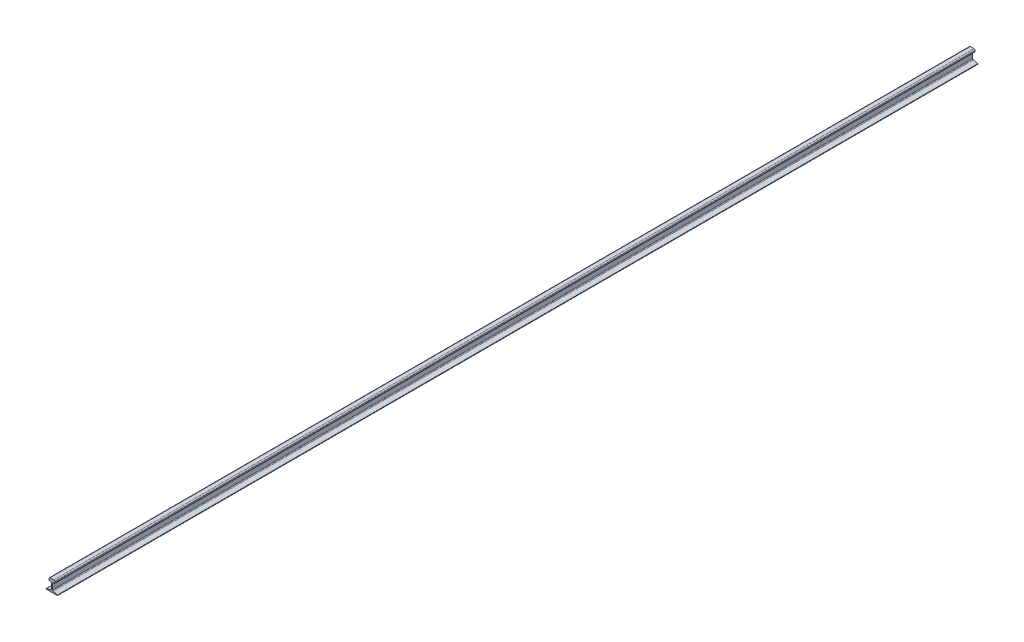
ISO-10303-21;
HEADER;
FILE_DESCRIPTION(('STEP AP214'),'2;1');
FILE_NAME('part.step','',(''),(''),'','','');
FILE_SCHEMA(('AUTOMOTIVE_DESIGN { 1 0 10303 214 1 1 1 1 }'));
ENDSEC;
DATA;
#1=APPLICATION_CONTEXT('core data for automotive mechanical design processes');
#2=APPLICATION_PROTOCOL_DEFINITION('international standard','automotive_design',2000,#1);
#3=PRODUCT_CONTEXT('',#1,'mechanical');
#4=PRODUCT('Part','Part','',(#3));
#5=PRODUCT_RELATED_PRODUCT_CATEGORY('part','',(#4));
#6=PRODUCT_DEFINITION_FORMATION('','',#4);
#7=PRODUCT_DEFINITION_CONTEXT('part definition',#1,'design');
#8=PRODUCT_DEFINITION('design','',#6,#7);
#9=PRODUCT_DEFINITION_SHAPE('','',#8);
#10=(LENGTH_UNIT() NAMED_UNIT(*) SI_UNIT(.MILLI.,.METRE.));
#11=(NAMED_UNIT(*) PLANE_ANGLE_UNIT() SI_UNIT($,.RADIAN.));
#12=(NAMED_UNIT(*) SI_UNIT($,.STERADIAN.) SOLID_ANGLE_UNIT());
#13=UNCERTAINTY_MEASURE_WITH_UNIT(LENGTH_MEASURE(1.E-05),#10,'distance_accuracy_value','');
#14=(GEOMETRIC_REPRESENTATION_CONTEXT(3) GLOBAL_UNCERTAINTY_ASSIGNED_CONTEXT((#13)) GLOBAL_UNIT_ASSIGNED_CONTEXT((#10,
#11,#12)) REPRESENTATION_CONTEXT('',''));
#15=CARTESIAN_POINT('',(0.,0.,0.));
#16=DIRECTION('',(0.,0.,1.));
#17=DIRECTION('',(1.,0.,0.));
#18=AXIS2_PLACEMENT_3D('',#15,#16,#17);
#19=CARTESIAN_POINT('',(-9.7,25.4,2500.));
#20=DIRECTION('',(0.,0.,-1.));
#21=DIRECTION('',(-1.,0.,0.));
#22=AXIS2_PLACEMENT_3D('',#19,#20,#21);
#23=CYLINDRICAL_SURFACE('',#22,6.35);
#24=CARTESIAN_POINT('',(-9.7,25.4,-2500.));
#25=DIRECTION('',(0.,0.,1.));
#26=DIRECTION('',(-1.,0.,0.));
#27=AXIS2_PLACEMENT_3D('',#24,#25,#26);
#28=CIRCLE('',#27,6.35);
#29=CARTESIAN_POINT('',(-9.7,31.75,-2500.));
#30=VERTEX_POINT('',#29);
#31=CARTESIAN_POINT('',(-16.05,25.4,-2500.));
#32=VERTEX_POINT('',#31);
#33=EDGE_CURVE('E238',#30,#32,#28,.T.);
#34=ORIENTED_EDGE('',*,*,#33,.T.);
#35=DIRECTION('',(0.,0.,-1.));
#36=VECTOR('',#35,1.);
#37=CARTESIAN_POINT('',(-16.05,25.4,2500.));
#38=LINE('',#37,#36);
#39=CARTESIAN_POINT('',(-16.05,25.4,2500.));
#40=VERTEX_POINT('',#39);
#41=EDGE_CURVE('E11',#40,#32,#38,.T.);
#42=ORIENTED_EDGE('',*,*,#41,.F.);
#43=CARTESIAN_POINT('',(-9.7,25.4,2500.));
#44=DIRECTION('',(0.,0.,1.));
#45=DIRECTION('',(-1.,0.,0.));
#46=AXIS2_PLACEMENT_3D('',#43,#44,#45);
#47=CIRCLE('',#46,6.35);
#48=CARTESIAN_POINT('',(-9.7,31.75,2500.));
#49=VERTEX_POINT('',#48);
#50=EDGE_CURVE('E308',#49,#40,#47,.T.);
#51=ORIENTED_EDGE('',*,*,#50,.F.);
#52=DIRECTION('',(0.,0.,-1.));
#53=VECTOR('',#52,1.);
#54=CARTESIAN_POINT('',(-9.7,31.75,2500.));
#55=LINE('',#54,#53);
#56=EDGE_CURVE('E234',#49,#30,#55,.T.);
#57=ORIENTED_EDGE('',*,*,#56,.T.);
#58=EDGE_LOOP('',(#34,#42,#51,#57));
#59=FACE_BOUND('',#58,.T.);
#60=ADVANCED_FACE('F41',(#59),#23,.T.);
#61=CARTESIAN_POINT('',(-16.05,19.8533423796229,2500.));
#62=DIRECTION('',(1.,0.,0.));
#63=DIRECTION('',(0.,0.,-1.));
#64=AXIS2_PLACEMENT_3D('',#61,#62,#63);
#65=PLANE('',#64);
#66=DIRECTION('',(0.,-1.,0.));
#67=VECTOR('',#66,1.);
#68=CARTESIAN_POINT('',(-16.05,19.8533423796229,-2500.));
#69=LINE('',#68,#67);
#70=CARTESIAN_POINT('',(-16.05,19.8533423796229,-2500.));
#71=VERTEX_POINT('',#70);
#72=EDGE_CURVE('E242',#32,#71,#69,.T.);
#73=ORIENTED_EDGE('',*,*,#72,.T.);
#74=DIRECTION('',(0.,0.,-1.));
#75=VECTOR('',#74,1.);
#76=CARTESIAN_POINT('',(-16.05,19.8533423796229,2500.));
#77=LINE('',#76,#75);
#78=CARTESIAN_POINT('',(-16.05,19.8533423796229,2500.));
#79=VERTEX_POINT('',#78);
#80=EDGE_CURVE('E50',#79,#71,#77,.T.);
#81=ORIENTED_EDGE('',*,*,#80,.F.);
#82=DIRECTION('',(0.,-1.,0.));
#83=VECTOR('',#82,1.);
#84=CARTESIAN_POINT('',(-16.05,19.8533423796229,2500.));
#85=LINE('',#84,#83);
#86=EDGE_CURVE('E149',#40,#79,#85,.T.);
#87=ORIENTED_EDGE('',*,*,#86,.F.);
#88=ORIENTED_EDGE('',*,*,#41,.T.);
#89=EDGE_LOOP('',(#73,#81,#87,#88));
#90=FACE_BOUND('',#89,.T.);
#91=ADVANCED_FACE('F486',(#90),#65,.F.);
#92=CARTESIAN_POINT('',(-14.46,19.8533423796229,2500.));
#93=DIRECTION('',(0.,0.,-1.));
#94=DIRECTION('',(-1.,0.,0.));
#95=AXIS2_PLACEMENT_3D('',#92,#93,#94);
#96=CYLINDRICAL_SURFACE('',#95,1.59);
#97=CARTESIAN_POINT('',(-14.46,19.8533423796229,-2500.));
#98=DIRECTION('',(0.,0.,1.));
#99=DIRECTION('',(-1.,0.,0.));
#100=AXIS2_PLACEMENT_3D('',#97,#98,#99);
#101=CIRCLE('',#100,1.59);
#102=CARTESIAN_POINT('',(-14.8176721764067,18.3040939766143,-2500.));
#103=VERTEX_POINT('',#102);
#104=EDGE_CURVE('E245',#71,#103,#101,.T.);
#105=ORIENTED_EDGE('',*,*,#104,.T.);
#106=DIRECTION('',(0.,0.,-1.));
#107=VECTOR('',#106,1.);
#108=CARTESIAN_POINT('',(-14.8176721764067,18.3040939766143,2500.));
#109=LINE('',#108,#107);
#110=CARTESIAN_POINT('',(-14.8176721764067,18.3040939766143,2500.));
#111=VERTEX_POINT('',#110);
#112=EDGE_CURVE('E383',#111,#103,#109,.T.);
#113=ORIENTED_EDGE('',*,*,#112,.F.);
#114=CARTESIAN_POINT('',(-14.46,19.8533423796229,2500.));
#115=DIRECTION('',(0.,0.,1.));
#116=DIRECTION('',(-1.,0.,0.));
#117=AXIS2_PLACEMENT_3D('',#114,#115,#116);
#118=CIRCLE('',#117,1.59);
#119=EDGE_CURVE('E393',#79,#111,#118,.T.);
#120=ORIENTED_EDGE('',*,*,#119,.F.);
#121=ORIENTED_EDGE('',*,*,#80,.T.);
#122=EDGE_LOOP('',(#105,#113,#120,#121));
#123=FACE_BOUND('',#122,.T.);
#124=ADVANCED_FACE('F391',(#123),#96,.T.);
#125=CARTESIAN_POINT('',(-6.6392329813232,16.415952513415,2500.));
#126=DIRECTION('',(0.224951054343864,0.974370064785236,0.));
#127=DIRECTION('',(-0.974370064785236,0.224951054343864,0.));
#128=AXIS2_PLACEMENT_3D('',#125,#126,#127);
#129=PLANE('',#128);
#130=DIRECTION('',(0.974370064785236,-0.224951054343864,0.));
#131=VECTOR('',#130,1.);
#132=CARTESIAN_POINT('',(-6.6392329813232,16.415952513415,-2500.));
#133=LINE('',#132,#131);
#134=CARTESIAN_POINT('',(-6.6392329813232,16.415952513415,-2500.));
#135=VERTEX_POINT('',#134);
#136=EDGE_CURVE('E248',#103,#135,#133,.T.);
#137=ORIENTED_EDGE('',*,*,#136,.T.);
#138=DIRECTION('',(0.,0.,-1.));
#139=VECTOR('',#138,1.);
#140=CARTESIAN_POINT('',(-6.6392329813232,16.415952513415,2500.));
#141=LINE('',#140,#139);
#142=CARTESIAN_POINT('',(-6.6392329813232,16.415952513415,2500.));
#143=VERTEX_POINT('',#142);
#144=EDGE_CURVE('E379',#143,#135,#141,.T.);
#145=ORIENTED_EDGE('',*,*,#144,.F.);
#146=DIRECTION('',(0.974370064785236,-0.224951054343864,0.));
#147=VECTOR('',#146,1.);
#148=CARTESIAN_POINT('',(-6.6392329813232,16.415952513415,2500.));
#149=LINE('',#148,#147);
#150=EDGE_CURVE('E412',#111,#143,#149,.T.);
#151=ORIENTED_EDGE('',*,*,#150,.F.);
#152=ORIENTED_EDGE('',*,*,#112,.T.);
#153=EDGE_LOOP('',(#137,#145,#151,#152));
#154=FACE_BOUND('',#153,.T.);
#155=ADVANCED_FACE('F402',(#154),#129,.F.);
#156=CARTESIAN_POINT('',(-7.70999999999999,11.7779510050373,2500.));
#157=DIRECTION('',(0.,0.,-1.));
#158=DIRECTION('',(-1.,0.,0.));
#159=AXIS2_PLACEMENT_3D('',#156,#157,#158);
#160=CYLINDRICAL_SURFACE('',#159,4.76);
#161=CARTESIAN_POINT('',(-7.70999999999999,11.7779510050373,-2500.));
#162=DIRECTION('',(0.,0.,-1.));
#163=DIRECTION('',(1.,0.,0.));
#164=AXIS2_PLACEMENT_3D('',#161,#162,#163);
#165=CIRCLE('',#164,4.76);
#166=CARTESIAN_POINT('',(-2.94999999999999,11.7779510050373,-2500.));
#167=VERTEX_POINT('',#166);
#168=EDGE_CURVE('E251',#135,#167,#165,.T.);
#169=ORIENTED_EDGE('',*,*,#168,.T.);
#170=DIRECTION('',(0.,0.,-1.));
#171=VECTOR('',#170,1.);
#172=CARTESIAN_POINT('',(-2.94999999999999,11.7779510050373,2500.));
#173=LINE('',#172,#171);
#174=CARTESIAN_POINT('',(-2.94999999999999,11.7779510050373,2500.));
#175=VERTEX_POINT('',#174);
#176=EDGE_CURVE('E375',#175,#167,#173,.T.);
#177=ORIENTED_EDGE('',*,*,#176,.F.);
#178=CARTESIAN_POINT('',(-7.70999999999999,11.7779510050373,2500.));
#179=DIRECTION('',(0.,0.,-1.));
#180=DIRECTION('',(1.,0.,0.));
#181=AXIS2_PLACEMENT_3D('',#178,#179,#180);
#182=CIRCLE('',#181,4.76);
#183=EDGE_CURVE('E408',#143,#175,#182,.T.);
#184=ORIENTED_EDGE('',*,*,#183,.F.);
#185=ORIENTED_EDGE('',*,*,#144,.T.);
#186=EDGE_LOOP('',(#169,#177,#184,#185));
#187=FACE_BOUND('',#186,.T.);
#188=ADVANCED_FACE('F406',(#187),#160,.F.);
#189=CARTESIAN_POINT('',(-2.94999999999998,-18.3447862004815,2500.));
#190=DIRECTION('',(1.,0.,0.));
#191=DIRECTION('',(0.,1.,0.));
#192=AXIS2_PLACEMENT_3D('',#189,#190,#191);
#193=PLANE('',#192);
#194=DIRECTION('',(0.,-1.,0.));
#195=VECTOR('',#194,1.);
#196=CARTESIAN_POINT('',(-2.94999999999998,-18.3447862004815,-2500.));
#197=LINE('',#196,#195);
#198=CARTESIAN_POINT('',(-2.94999999999998,-18.3447862004815,-2500.));
#199=VERTEX_POINT('',#198);
#200=EDGE_CURVE('E254',#167,#199,#197,.T.);
#201=ORIENTED_EDGE('',*,*,#200,.T.);
#202=DIRECTION('',(0.,0.,-1.));
#203=VECTOR('',#202,1.);
#204=CARTESIAN_POINT('',(-2.94999999999998,-18.3447862004815,2500.));
#205=LINE('',#204,#203);
#206=CARTESIAN_POINT('',(-2.94999999999998,-18.3447862004815,2500.));
#207=VERTEX_POINT('',#206);
#208=EDGE_CURVE('E371',#207,#199,#205,.T.);
#209=ORIENTED_EDGE('',*,*,#208,.F.);
#210=DIRECTION('',(0.,-1.,0.));
#211=VECTOR('',#210,1.);
#212=CARTESIAN_POINT('',(-2.94999999999998,-18.3447862004815,2500.));
#213=LINE('',#212,#211);
#214=EDGE_CURVE('E411',#175,#207,#213,.T.);
#215=ORIENTED_EDGE('',*,*,#214,.F.);
#216=ORIENTED_EDGE('',*,*,#176,.T.);
#217=EDGE_LOOP('',(#201,#209,#215,#216));
#218=FACE_BOUND('',#217,.T.);
#219=ADVANCED_FACE('F499',(#218),#193,.F.);
#220=CARTESIAN_POINT('',(-7.70999999999998,-18.3447862004815,2500.));
#221=DIRECTION('',(0.,0.,-1.));
#222=DIRECTION('',(-1.,0.,0.));
#223=AXIS2_PLACEMENT_3D('',#220,#221,#222);
#224=CYLINDRICAL_SURFACE('',#223,4.76);
#225=CARTESIAN_POINT('',(-7.70999999999998,-18.3447862004815,-2500.));
#226=DIRECTION('',(0.,0.,-1.));
#227=DIRECTION('',(1.,0.,0.));
#228=AXIS2_PLACEMENT_3D('',#225,#226,#227);
#229=CIRCLE('',#228,4.76);
#230=CARTESIAN_POINT('',(-6.63923298132321,-22.9827877088592,-2500.));
#231=VERTEX_POINT('',#230);
#232=EDGE_CURVE('E257',#199,#231,#229,.T.);
#233=ORIENTED_EDGE('',*,*,#232,.T.);
#234=DIRECTION('',(0.,0.,-1.));
#235=VECTOR('',#234,1.);
#236=CARTESIAN_POINT('',(-6.63923298132321,-22.9827877088592,2500.));
#237=LINE('',#236,#235);
#238=CARTESIAN_POINT('',(-6.63923298132321,-22.9827877088592,2500.));
#239=VERTEX_POINT('',#238);
#240=EDGE_CURVE('E367',#239,#231,#237,.T.);
#241=ORIENTED_EDGE('',*,*,#240,.F.);
#242=CARTESIAN_POINT('',(-7.70999999999998,-18.3447862004815,2500.));
#243=DIRECTION('',(0.,0.,-1.));
#244=DIRECTION('',(1.,0.,0.));
#245=AXIS2_PLACEMENT_3D('',#242,#243,#244);
#246=CIRCLE('',#245,4.76);
#247=EDGE_CURVE('E416',#207,#239,#246,.T.);
#248=ORIENTED_EDGE('',*,*,#247,.F.);
#249=ORIENTED_EDGE('',*,*,#208,.T.);
#250=EDGE_LOOP('',(#233,#241,#248,#249));
#251=FACE_BOUND('',#250,.T.);
#252=ADVANCED_FACE('F502',(#251),#224,.F.);
#253=CARTESIAN_POINT('',(-30.5176721764067,-28.4955597727298,2500.));
#254=DIRECTION('',(0.22495105434386,-0.974370064785236,0.));
#255=DIRECTION('',(0.974370064785236,0.22495105434386,0.));
#256=AXIS2_PLACEMENT_3D('',#253,#254,#255);
#257=PLANE('',#256);
#258=DIRECTION('',(-0.974370064785236,-0.22495105434386,0.));
#259=VECTOR('',#258,1.);
#260=CARTESIAN_POINT('',(-30.5176721764067,-28.4955597727298,-2500.));
#261=LINE('',#260,#259);
#262=CARTESIAN_POINT('',(-30.5176721764067,-28.4955597727298,-2500.));
#263=VERTEX_POINT('',#262);
#264=EDGE_CURVE('E260',#231,#263,#261,.T.);
#265=ORIENTED_EDGE('',*,*,#264,.T.);
#266=DIRECTION('',(0.,0.,-1.));
#267=VECTOR('',#266,1.);
#268=CARTESIAN_POINT('',(-30.5176721764067,-28.4955597727298,2500.));
#269=LINE('',#268,#267);
#270=CARTESIAN_POINT('',(-30.5176721764067,-28.4955597727298,2500.));
#271=VERTEX_POINT('',#270);
#272=EDGE_CURVE('E363',#271,#263,#269,.T.);
#273=ORIENTED_EDGE('',*,*,#272,.F.);
#274=DIRECTION('',(-0.974370064785236,-0.22495105434386,0.));
#275=VECTOR('',#274,1.);
#276=CARTESIAN_POINT('',(-30.5176721764067,-28.4955597727298,2500.));
#277=LINE('',#276,#275);
#278=EDGE_CURVE('E423',#239,#271,#277,.T.);
#279=ORIENTED_EDGE('',*,*,#278,.F.);
#280=ORIENTED_EDGE('',*,*,#240,.T.);
#281=EDGE_LOOP('',(#265,#273,#279,#280));
#282=FACE_BOUND('',#281,.T.);
#283=ADVANCED_FACE('F506',(#282),#257,.F.);
#284=CARTESIAN_POINT('',(-30.16,-30.0448081757383,2500.));
#285=DIRECTION('',(0.,0.,-1.));
#286=DIRECTION('',(-1.,0.,0.));
#287=AXIS2_PLACEMENT_3D('',#284,#285,#286);
#288=CYLINDRICAL_SURFACE('',#287,1.59);
#289=CARTESIAN_POINT('',(-30.16,-30.0448081757383,-2500.));
#290=DIRECTION('',(0.,0.,1.));
#291=DIRECTION('',(-1.,0.,0.));
#292=AXIS2_PLACEMENT_3D('',#289,#290,#291);
#293=CIRCLE('',#292,1.59);
#294=CARTESIAN_POINT('',(-31.75,-30.0448081757383,-2500.));
#295=VERTEX_POINT('',#294);
#296=EDGE_CURVE('E263',#263,#295,#293,.T.);
#297=ORIENTED_EDGE('',*,*,#296,.T.);
#298=DIRECTION('',(0.,0.,-1.));
#299=VECTOR('',#298,1.);
#300=CARTESIAN_POINT('',(-31.75,-30.0448081757383,2500.));
#301=LINE('',#300,#299);
#302=CARTESIAN_POINT('',(-31.75,-30.0448081757383,2500.));
#303=VERTEX_POINT('',#302);
#304=EDGE_CURVE('E359',#303,#295,#301,.T.);
#305=ORIENTED_EDGE('',*,*,#304,.F.);
#306=CARTESIAN_POINT('',(-30.16,-30.0448081757383,2500.));
#307=DIRECTION('',(0.,0.,1.));
#308=DIRECTION('',(-1.,0.,0.));
#309=AXIS2_PLACEMENT_3D('',#306,#307,#308);
#310=CIRCLE('',#309,1.59);
#311=EDGE_CURVE('E426',#271,#303,#310,.T.);
#312=ORIENTED_EDGE('',*,*,#311,.F.);
#313=ORIENTED_EDGE('',*,*,#272,.T.);
#314=EDGE_LOOP('',(#297,#305,#312,#313));
#315=FACE_BOUND('',#314,.T.);
#316=ADVANCED_FACE('F510',(#315),#288,.T.);
#317=CARTESIAN_POINT('',(-31.75,-30.16,2500.));
#318=DIRECTION('',(1.,0.,0.));
#319=DIRECTION('',(0.,0.,-1.));
#320=AXIS2_PLACEMENT_3D('',#317,#318,#319);
#321=PLANE('',#320);
#322=DIRECTION('',(0.,-1.,0.));
#323=VECTOR('',#322,1.);
#324=CARTESIAN_POINT('',(-31.75,-30.16,-2500.));
#325=LINE('',#324,#323);
#326=CARTESIAN_POINT('',(-31.75,-30.16,-2500.));
#327=VERTEX_POINT('',#326);
#328=EDGE_CURVE('E266',#295,#327,#325,.T.);
#329=ORIENTED_EDGE('',*,*,#328,.T.);
#330=DIRECTION('',(0.,0.,-1.));
#331=VECTOR('',#330,1.);
#332=CARTESIAN_POINT('',(-31.75,-30.16,2500.));
#333=LINE('',#332,#331);
#334=CARTESIAN_POINT('',(-31.75,-30.16,2500.));
#335=VERTEX_POINT('',#334);
#336=EDGE_CURVE('E355',#335,#327,#333,.T.);
#337=ORIENTED_EDGE('',*,*,#336,.F.);
#338=DIRECTION('',(0.,-1.,0.));
#339=VECTOR('',#338,1.);
#340=CARTESIAN_POINT('',(-31.75,-30.16,2500.));
#341=LINE('',#340,#339);
#342=EDGE_CURVE('E429',#303,#335,#341,.T.);
#343=ORIENTED_EDGE('',*,*,#342,.F.);
#344=ORIENTED_EDGE('',*,*,#304,.T.);
#345=EDGE_LOOP('',(#329,#337,#343,#344));
#346=FACE_BOUND('',#345,.T.);
#347=ADVANCED_FACE('F514',(#346),#321,.F.);
#348=CARTESIAN_POINT('',(-30.16,-30.16,2500.));
#349=DIRECTION('',(0.,0.,-1.));
#350=DIRECTION('',(-1.,0.,0.));
#351=AXIS2_PLACEMENT_3D('',#348,#349,#350);
#352=CYLINDRICAL_SURFACE('',#351,1.59);
#353=CARTESIAN_POINT('',(-30.16,-30.16,-2500.));
#354=DIRECTION('',(0.,0.,1.));
#355=DIRECTION('',(-1.,0.,0.));
#356=AXIS2_PLACEMENT_3D('',#353,#354,#355);
#357=CIRCLE('',#356,1.59);
#358=CARTESIAN_POINT('',(-30.16,-31.75,-2500.));
#359=VERTEX_POINT('',#358);
#360=EDGE_CURVE('E269',#327,#359,#357,.T.);
#361=ORIENTED_EDGE('',*,*,#360,.T.);
#362=DIRECTION('',(0.,0.,-1.));
#363=VECTOR('',#362,1.);
#364=CARTESIAN_POINT('',(-30.16,-31.75,2500.));
#365=LINE('',#364,#363);
#366=CARTESIAN_POINT('',(-30.16,-31.75,2500.));
#367=VERTEX_POINT('',#366);
#368=EDGE_CURVE('E351',#367,#359,#365,.T.);
#369=ORIENTED_EDGE('',*,*,#368,.F.);
#370=CARTESIAN_POINT('',(-30.16,-30.16,2500.));
#371=DIRECTION('',(0.,0.,1.));
#372=DIRECTION('',(-1.,0.,0.));
#373=AXIS2_PLACEMENT_3D('',#370,#371,#372);
#374=CIRCLE('',#373,1.59);
#375=EDGE_CURVE('E432',#335,#367,#374,.T.);
#376=ORIENTED_EDGE('',*,*,#375,.F.);
#377=ORIENTED_EDGE('',*,*,#336,.T.);
#378=EDGE_LOOP('',(#361,#369,#376,#377));
#379=FACE_BOUND('',#378,.T.);
#380=ADVANCED_FACE('F518',(#379),#352,.T.);
#381=CARTESIAN_POINT('',(30.16,-31.75,2500.));
#382=DIRECTION('',(0.,1.,0.));
#383=DIRECTION('',(-1.,0.,0.));
#384=AXIS2_PLACEMENT_3D('',#381,#382,#383);
#385=PLANE('',#384);
#386=DIRECTION('',(1.,0.,0.));
#387=VECTOR('',#386,1.);
#388=CARTESIAN_POINT('',(30.16,-31.75,-2500.));
#389=LINE('',#388,#387);
#390=CARTESIAN_POINT('',(30.16,-31.75,-2500.));
#391=VERTEX_POINT('',#390);
#392=EDGE_CURVE('E272',#359,#391,#389,.T.);
#393=ORIENTED_EDGE('',*,*,#392,.T.);
#394=DIRECTION('',(0.,0.,-1.));
#395=VECTOR('',#394,1.);
#396=CARTESIAN_POINT('',(30.16,-31.75,2500.));
#397=LINE('',#396,#395);
#398=CARTESIAN_POINT('',(30.16,-31.75,2500.));
#399=VERTEX_POINT('',#398);
#400=EDGE_CURVE('E347',#399,#391,#397,.T.);
#401=ORIENTED_EDGE('',*,*,#400,.F.);
#402=DIRECTION('',(1.,0.,0.));
#403=VECTOR('',#402,1.);
#404=CARTESIAN_POINT('',(30.16,-31.75,2500.));
#405=LINE('',#404,#403);
#406=EDGE_CURVE('E435',#367,#399,#405,.T.);
#407=ORIENTED_EDGE('',*,*,#406,.F.);
#408=ORIENTED_EDGE('',*,*,#368,.T.);
#409=EDGE_LOOP('',(#393,#401,#407,#408));
#410=FACE_BOUND('',#409,.T.);
#411=ADVANCED_FACE('F522',(#410),#385,.F.);
#412=CARTESIAN_POINT('',(30.16,-30.16,2500.));
#413=DIRECTION('',(0.,0.,-1.));
#414=DIRECTION('',(-1.,0.,0.));
#415=AXIS2_PLACEMENT_3D('',#412,#413,#414);
#416=CYLINDRICAL_SURFACE('',#415,1.58999999999999);
#417=CARTESIAN_POINT('',(30.16,-30.16,-2500.));
#418=DIRECTION('',(0.,0.,1.));
#419=DIRECTION('',(-1.,0.,0.));
#420=AXIS2_PLACEMENT_3D('',#417,#418,#419);
#421=CIRCLE('',#420,1.58999999999999);
#422=CARTESIAN_POINT('',(31.75,-30.16,-2500.));
#423=VERTEX_POINT('',#422);
#424=EDGE_CURVE('E275',#391,#423,#421,.T.);
#425=ORIENTED_EDGE('',*,*,#424,.T.);
#426=DIRECTION('',(0.,0.,-1.));
#427=VECTOR('',#426,1.);
#428=CARTESIAN_POINT('',(31.75,-30.16,2500.));
#429=LINE('',#428,#427);
#430=CARTESIAN_POINT('',(31.75,-30.16,2500.));
#431=VERTEX_POINT('',#430);
#432=EDGE_CURVE('E343',#431,#423,#429,.T.);
#433=ORIENTED_EDGE('',*,*,#432,.F.);
#434=CARTESIAN_POINT('',(30.16,-30.16,2500.));
#435=DIRECTION('',(0.,0.,1.));
#436=DIRECTION('',(-1.,0.,0.));
#437=AXIS2_PLACEMENT_3D('',#434,#435,#436);
#438=CIRCLE('',#437,1.58999999999999);
#439=EDGE_CURVE('E438',#399,#431,#438,.T.);
#440=ORIENTED_EDGE('',*,*,#439,.F.);
#441=ORIENTED_EDGE('',*,*,#400,.T.);
#442=EDGE_LOOP('',(#425,#433,#440,#441));
#443=FACE_BOUND('',#442,.T.);
#444=ADVANCED_FACE('F526',(#443),#416,.T.);
#445=CARTESIAN_POINT('',(31.75,-30.0448081757383,2500.));
#446=DIRECTION('',(-1.,0.,0.));
#447=DIRECTION('',(0.,0.,1.));
#448=AXIS2_PLACEMENT_3D('',#445,#446,#447);
#449=PLANE('',#448);
#450=DIRECTION('',(0.,1.,0.));
#451=VECTOR('',#450,1.);
#452=CARTESIAN_POINT('',(31.75,-30.0448081757383,-2500.));
#453=LINE('',#452,#451);
#454=CARTESIAN_POINT('',(31.75,-30.0448081757383,-2500.));
#455=VERTEX_POINT('',#454);
#456=EDGE_CURVE('E278',#423,#455,#453,.T.);
#457=ORIENTED_EDGE('',*,*,#456,.T.);
#458=DIRECTION('',(0.,0.,-1.));
#459=VECTOR('',#458,1.);
#460=CARTESIAN_POINT('',(31.75,-30.0448081757383,2500.));
#461=LINE('',#460,#459);
#462=CARTESIAN_POINT('',(31.75,-30.0448081757383,2500.));
#463=VERTEX_POINT('',#462);
#464=EDGE_CURVE('E339',#463,#455,#461,.T.);
#465=ORIENTED_EDGE('',*,*,#464,.F.);
#466=DIRECTION('',(0.,1.,0.));
#467=VECTOR('',#466,1.);
#468=CARTESIAN_POINT('',(31.75,-30.0448081757383,2500.));
#469=LINE('',#468,#467);
#470=EDGE_CURVE('E441',#431,#463,#469,.T.);
#471=ORIENTED_EDGE('',*,*,#470,.F.);
#472=ORIENTED_EDGE('',*,*,#432,.T.);
#473=EDGE_LOOP('',(#457,#465,#471,#472));
#474=FACE_BOUND('',#473,.T.);
#475=ADVANCED_FACE('F530',(#474),#449,.F.);
#476=CARTESIAN_POINT('',(30.16,-30.0448081757383,2500.));
#477=DIRECTION('',(0.,0.,-1.));
#478=DIRECTION('',(-1.,0.,0.));
#479=AXIS2_PLACEMENT_3D('',#476,#477,#478);
#480=CYLINDRICAL_SURFACE('',#479,1.59);
#481=CARTESIAN_POINT('',(30.16,-30.0448081757383,-2500.));
#482=DIRECTION('',(0.,0.,1.));
#483=DIRECTION('',(1.,0.,0.));
#484=AXIS2_PLACEMENT_3D('',#481,#482,#483);
#485=CIRCLE('',#484,1.59);
#486=CARTESIAN_POINT('',(30.5176721764067,-28.4955597727298,-2500.));
#487=VERTEX_POINT('',#486);
#488=EDGE_CURVE('E281',#455,#487,#485,.T.);
#489=ORIENTED_EDGE('',*,*,#488,.T.);
#490=DIRECTION('',(0.,0.,-1.));
#491=VECTOR('',#490,1.);
#492=CARTESIAN_POINT('',(30.5176721764067,-28.4955597727298,2500.));
#493=LINE('',#492,#491);
#494=CARTESIAN_POINT('',(30.5176721764067,-28.4955597727298,2500.));
#495=VERTEX_POINT('',#494);
#496=EDGE_CURVE('E335',#495,#487,#493,.T.);
#497=ORIENTED_EDGE('',*,*,#496,.F.);
#498=CARTESIAN_POINT('',(30.16,-30.0448081757383,2500.));
#499=DIRECTION('',(0.,0.,1.));
#500=DIRECTION('',(1.,0.,0.));
#501=AXIS2_PLACEMENT_3D('',#498,#499,#500);
#502=CIRCLE('',#501,1.59);
#503=EDGE_CURVE('E444',#463,#495,#502,.T.);
#504=ORIENTED_EDGE('',*,*,#503,.F.);
#505=ORIENTED_EDGE('',*,*,#464,.T.);
#506=EDGE_LOOP('',(#489,#497,#504,#505));
#507=FACE_BOUND('',#506,.T.);
#508=ADVANCED_FACE('F534',(#507),#480,.T.);
#509=CARTESIAN_POINT('',(6.63923298132323,-22.9827877088592,2500.));
#510=DIRECTION('',(-0.22495105434386,-0.974370064785236,0.));
#511=DIRECTION('',(0.974370064785236,-0.22495105434386,0.));
#512=AXIS2_PLACEMENT_3D('',#509,#510,#511);
#513=PLANE('',#512);
#514=DIRECTION('',(-0.974370064785236,0.22495105434386,0.));
#515=VECTOR('',#514,1.);
#516=CARTESIAN_POINT('',(6.63923298132323,-22.9827877088592,-2500.));
#517=LINE('',#516,#515);
#518=CARTESIAN_POINT('',(6.63923298132323,-22.9827877088592,-2500.));
#519=VERTEX_POINT('',#518);
#520=EDGE_CURVE('E284',#487,#519,#517,.T.);
#521=ORIENTED_EDGE('',*,*,#520,.T.);
#522=DIRECTION('',(0.,0.,-1.));
#523=VECTOR('',#522,1.);
#524=CARTESIAN_POINT('',(6.63923298132323,-22.9827877088592,2500.));
#525=LINE('',#524,#523);
#526=CARTESIAN_POINT('',(6.63923298132323,-22.9827877088592,2500.));
#527=VERTEX_POINT('',#526);
#528=EDGE_CURVE('E331',#527,#519,#525,.T.);
#529=ORIENTED_EDGE('',*,*,#528,.F.);
#530=DIRECTION('',(-0.974370064785236,0.22495105434386,0.));
#531=VECTOR('',#530,1.);
#532=CARTESIAN_POINT('',(6.63923298132323,-22.9827877088592,2500.));
#533=LINE('',#532,#531);
#534=EDGE_CURVE('E447',#495,#527,#533,.T.);
#535=ORIENTED_EDGE('',*,*,#534,.F.);
#536=ORIENTED_EDGE('',*,*,#496,.T.);
#537=EDGE_LOOP('',(#521,#529,#535,#536));
#538=FACE_BOUND('',#537,.T.);
#539=ADVANCED_FACE('F538',(#538),#513,.F.);
#540=CARTESIAN_POINT('',(7.71,-18.3447862004815,2500.));
#541=DIRECTION('',(0.,0.,-1.));
#542=DIRECTION('',(-1.,0.,0.));
#543=AXIS2_PLACEMENT_3D('',#540,#541,#542);
#544=CYLINDRICAL_SURFACE('',#543,4.76);
#545=CARTESIAN_POINT('',(7.71,-18.3447862004815,-2500.));
#546=DIRECTION('',(0.,0.,-1.));
#547=DIRECTION('',(-1.,0.,0.));
#548=AXIS2_PLACEMENT_3D('',#545,#546,#547);
#549=CIRCLE('',#548,4.76);
#550=CARTESIAN_POINT('',(2.95,-18.3447862004815,-2500.));
#551=VERTEX_POINT('',#550);
#552=EDGE_CURVE('E287',#519,#551,#549,.T.);
#553=ORIENTED_EDGE('',*,*,#552,.T.);
#554=DIRECTION('',(0.,0.,-1.));
#555=VECTOR('',#554,1.);
#556=CARTESIAN_POINT('',(2.95,-18.3447862004815,2500.));
#557=LINE('',#556,#555);
#558=CARTESIAN_POINT('',(2.95,-18.3447862004815,2500.));
#559=VERTEX_POINT('',#558);
#560=EDGE_CURVE('E327',#559,#551,#557,.T.);
#561=ORIENTED_EDGE('',*,*,#560,.F.);
#562=CARTESIAN_POINT('',(7.71,-18.3447862004815,2500.));
#563=DIRECTION('',(0.,0.,-1.));
#564=DIRECTION('',(-1.,0.,0.));
#565=AXIS2_PLACEMENT_3D('',#562,#563,#564);
#566=CIRCLE('',#565,4.76);
#567=EDGE_CURVE('E450',#527,#559,#566,.T.);
#568=ORIENTED_EDGE('',*,*,#567,.F.);
#569=ORIENTED_EDGE('',*,*,#528,.T.);
#570=EDGE_LOOP('',(#553,#561,#568,#569));
#571=FACE_BOUND('',#570,.T.);
#572=ADVANCED_FACE('F542',(#571),#544,.F.);
#573=CARTESIAN_POINT('',(2.95,11.7779510050373,2500.));
#574=DIRECTION('',(-1.,0.,0.));
#575=DIRECTION('',(0.,-1.,0.));
#576=AXIS2_PLACEMENT_3D('',#573,#574,#575);
#577=PLANE('',#576);
#578=DIRECTION('',(0.,1.,0.));
#579=VECTOR('',#578,1.);
#580=CARTESIAN_POINT('',(2.95,11.7779510050373,-2500.));
#581=LINE('',#580,#579);
#582=CARTESIAN_POINT('',(2.95,11.7779510050373,-2500.));
#583=VERTEX_POINT('',#582);
#584=EDGE_CURVE('E290',#551,#583,#581,.T.);
#585=ORIENTED_EDGE('',*,*,#584,.T.);
#586=DIRECTION('',(0.,0.,-1.));
#587=VECTOR('',#586,1.);
#588=CARTESIAN_POINT('',(2.95,11.7779510050373,2500.));
#589=LINE('',#588,#587);
#590=CARTESIAN_POINT('',(2.95,11.7779510050373,2500.));
#591=VERTEX_POINT('',#590);
#592=EDGE_CURVE('E323',#591,#583,#589,.T.);
#593=ORIENTED_EDGE('',*,*,#592,.F.);
#594=DIRECTION('',(0.,1.,0.));
#595=VECTOR('',#594,1.);
#596=CARTESIAN_POINT('',(2.95,11.7779510050373,2500.));
#597=LINE('',#596,#595);
#598=EDGE_CURVE('E453',#559,#591,#597,.T.);
#599=ORIENTED_EDGE('',*,*,#598,.F.);
#600=ORIENTED_EDGE('',*,*,#560,.T.);
#601=EDGE_LOOP('',(#585,#593,#599,#600));
#602=FACE_BOUND('',#601,.T.);
#603=ADVANCED_FACE('F546',(#602),#577,.F.);
#604=CARTESIAN_POINT('',(7.71,11.7779510050373,2500.));
#605=DIRECTION('',(0.,0.,-1.));
#606=DIRECTION('',(-1.,0.,0.));
#607=AXIS2_PLACEMENT_3D('',#604,#605,#606);
#608=CYLINDRICAL_SURFACE('',#607,4.76);
#609=CARTESIAN_POINT('',(7.71,11.7779510050373,-2500.));
#610=DIRECTION('',(0.,0.,-1.));
#611=DIRECTION('',(1.,0.,0.));
#612=AXIS2_PLACEMENT_3D('',#609,#610,#611);
#613=CIRCLE('',#612,4.76);
#614=CARTESIAN_POINT('',(6.63923298132321,16.415952513415,-2500.));
#615=VERTEX_POINT('',#614);
#616=EDGE_CURVE('E293',#583,#615,#613,.T.);
#617=ORIENTED_EDGE('',*,*,#616,.T.);
#618=DIRECTION('',(0.,0.,-1.));
#619=VECTOR('',#618,1.);
#620=CARTESIAN_POINT('',(6.63923298132321,16.415952513415,2500.));
#621=LINE('',#620,#619);
#622=CARTESIAN_POINT('',(6.63923298132321,16.415952513415,2500.));
#623=VERTEX_POINT('',#622);
#624=EDGE_CURVE('E319',#623,#615,#621,.T.);
#625=ORIENTED_EDGE('',*,*,#624,.F.);
#626=CARTESIAN_POINT('',(7.71,11.7779510050373,2500.));
#627=DIRECTION('',(0.,0.,-1.));
#628=DIRECTION('',(1.,0.,0.));
#629=AXIS2_PLACEMENT_3D('',#626,#627,#628);
#630=CIRCLE('',#629,4.76);
#631=EDGE_CURVE('E456',#591,#623,#630,.T.);
#632=ORIENTED_EDGE('',*,*,#631,.F.);
#633=ORIENTED_EDGE('',*,*,#592,.T.);
#634=EDGE_LOOP('',(#617,#625,#632,#633));
#635=FACE_BOUND('',#634,.T.);
#636=ADVANCED_FACE('F550',(#635),#608,.F.);
#637=CARTESIAN_POINT('',(14.8176721764068,18.3040939766144,2500.));
#638=DIRECTION('',(-0.224951054343864,0.974370064785236,0.));
#639=DIRECTION('',(-0.974370064785236,-0.224951054343864,0.));
#640=AXIS2_PLACEMENT_3D('',#637,#638,#639);
#641=PLANE('',#640);
#642=DIRECTION('',(0.974370064785235,0.224951054343863,0.));
#643=VECTOR('',#642,1.);
#644=CARTESIAN_POINT('',(14.8176721764068,18.3040939766144,-2500.));
#645=LINE('',#644,#643);
#646=CARTESIAN_POINT('',(14.8176721764068,18.3040939766144,-2500.));
#647=VERTEX_POINT('',#646);
#648=EDGE_CURVE('E296',#615,#647,#645,.T.);
#649=ORIENTED_EDGE('',*,*,#648,.T.);
#650=DIRECTION('',(0.,0.,-1.));
#651=VECTOR('',#650,1.);
#652=CARTESIAN_POINT('',(14.8176721764068,18.3040939766144,2500.));
#653=LINE('',#652,#651);
#654=CARTESIAN_POINT('',(14.8176721764068,18.3040939766144,2500.));
#655=VERTEX_POINT('',#654);
#656=EDGE_CURVE('E315',#655,#647,#653,.T.);
#657=ORIENTED_EDGE('',*,*,#656,.F.);
#658=DIRECTION('',(0.974370064785235,0.224951054343863,0.));
#659=VECTOR('',#658,1.);
#660=CARTESIAN_POINT('',(14.8176721764068,18.3040939766144,2500.));
#661=LINE('',#660,#659);
#662=EDGE_CURVE('E459',#623,#655,#661,.T.);
#663=ORIENTED_EDGE('',*,*,#662,.F.);
#664=ORIENTED_EDGE('',*,*,#624,.T.);
#665=EDGE_LOOP('',(#649,#657,#663,#664));
#666=FACE_BOUND('',#665,.T.);
#667=ADVANCED_FACE('F467',(#666),#641,.F.);
#668=CARTESIAN_POINT('',(14.46,19.8533423796229,2500.));
#669=DIRECTION('',(0.,0.,-1.));
#670=DIRECTION('',(-1.,0.,0.));
#671=AXIS2_PLACEMENT_3D('',#668,#669,#670);
#672=CYLINDRICAL_SURFACE('',#671,1.59);
#673=CARTESIAN_POINT('',(14.46,19.8533423796229,-2500.));
#674=DIRECTION('',(0.,0.,1.));
#675=DIRECTION('',(-1.,0.,0.));
#676=AXIS2_PLACEMENT_3D('',#673,#674,#675);
#677=CIRCLE('',#676,1.59);
#678=CARTESIAN_POINT('',(16.05,19.8533423796229,-2500.));
#679=VERTEX_POINT('',#678);
#680=EDGE_CURVE('E299',#647,#679,#677,.T.);
#681=ORIENTED_EDGE('',*,*,#680,.T.);
#682=DIRECTION('',(0.,0.,-1.));
#683=VECTOR('',#682,1.);
#684=CARTESIAN_POINT('',(16.05,19.8533423796229,2500.));
#685=LINE('',#684,#683);
#686=CARTESIAN_POINT('',(16.05,19.8533423796229,2500.));
#687=VERTEX_POINT('',#686);
#688=EDGE_CURVE('E227',#687,#679,#685,.T.);
#689=ORIENTED_EDGE('',*,*,#688,.F.);
#690=CARTESIAN_POINT('',(14.46,19.8533423796229,2500.));
#691=DIRECTION('',(0.,0.,1.));
#692=DIRECTION('',(-1.,0.,0.));
#693=AXIS2_PLACEMENT_3D('',#690,#691,#692);
#694=CIRCLE('',#693,1.59);
#695=EDGE_CURVE('E216',#655,#687,#694,.T.);
#696=ORIENTED_EDGE('',*,*,#695,.F.);
#697=ORIENTED_EDGE('',*,*,#656,.T.);
#698=EDGE_LOOP('',(#681,#689,#696,#697));
#699=FACE_BOUND('',#698,.T.);
#700=ADVANCED_FACE('F471',(#699),#672,.T.);
#701=CARTESIAN_POINT('',(16.05,25.4,2500.));
#702=DIRECTION('',(-1.,0.,0.));
#703=DIRECTION('',(0.,0.,1.));
#704=AXIS2_PLACEMENT_3D('',#701,#702,#703);
#705=PLANE('',#704);
#706=DIRECTION('',(0.,1.,0.));
#707=VECTOR('',#706,1.);
#708=CARTESIAN_POINT('',(16.05,25.4,-2500.));
#709=LINE('',#708,#707);
#710=CARTESIAN_POINT('',(16.05,25.4,-2500.));
#711=VERTEX_POINT('',#710);
#712=EDGE_CURVE('E225',#679,#711,#709,.T.);
#713=ORIENTED_EDGE('',*,*,#712,.T.);
#714=DIRECTION('',(0.,0.,-1.));
#715=VECTOR('',#714,1.);
#716=CARTESIAN_POINT('',(16.05,25.4,2500.));
#717=LINE('',#716,#715);
#718=CARTESIAN_POINT('',(16.05,25.4,2500.));
#719=VERTEX_POINT('',#718);
#720=EDGE_CURVE('E222',#719,#711,#717,.T.);
#721=ORIENTED_EDGE('',*,*,#720,.F.);
#722=DIRECTION('',(0.,1.,0.));
#723=VECTOR('',#722,1.);
#724=CARTESIAN_POINT('',(16.05,25.4,2500.));
#725=LINE('',#724,#723);
#726=EDGE_CURVE('E210',#687,#719,#725,.T.);
#727=ORIENTED_EDGE('',*,*,#726,.F.);
#728=ORIENTED_EDGE('',*,*,#688,.T.);
#729=EDGE_LOOP('',(#713,#721,#727,#728));
#730=FACE_BOUND('',#729,.T.);
#731=ADVANCED_FACE('F223',(#730),#705,.F.);
#732=CARTESIAN_POINT('',(9.70000000000001,25.4,2500.));
#733=DIRECTION('',(0.,0.,-1.));
#734=DIRECTION('',(-1.,0.,0.));
#735=AXIS2_PLACEMENT_3D('',#732,#733,#734);
#736=CYLINDRICAL_SURFACE('',#735,6.35);
#737=CARTESIAN_POINT('',(9.70000000000001,25.4,-2500.));
#738=DIRECTION('',(0.,0.,1.));
#739=DIRECTION('',(1.,0.,0.));
#740=AXIS2_PLACEMENT_3D('',#737,#738,#739);
#741=CIRCLE('',#740,6.35);
#742=CARTESIAN_POINT('',(9.70000000000001,31.75,-2500.));
#743=VERTEX_POINT('',#742);
#744=EDGE_CURVE('E135',#711,#743,#741,.T.);
#745=ORIENTED_EDGE('',*,*,#744,.T.);
#746=DIRECTION('',(0.,0.,-1.));
#747=VECTOR('',#746,1.);
#748=CARTESIAN_POINT('',(9.70000000000001,31.75,2500.));
#749=LINE('',#748,#747);
#750=CARTESIAN_POINT('',(9.70000000000001,31.75,2500.));
#751=VERTEX_POINT('',#750);
#752=EDGE_CURVE('E228',#751,#743,#749,.T.);
#753=ORIENTED_EDGE('',*,*,#752,.F.);
#754=CARTESIAN_POINT('',(9.70000000000001,25.4,2500.));
#755=DIRECTION('',(0.,0.,1.));
#756=DIRECTION('',(1.,0.,0.));
#757=AXIS2_PLACEMENT_3D('',#754,#755,#756);
#758=CIRCLE('',#757,6.35);
#759=EDGE_CURVE('E214',#719,#751,#758,.T.);
#760=ORIENTED_EDGE('',*,*,#759,.F.);
#761=ORIENTED_EDGE('',*,*,#720,.T.);
#762=EDGE_LOOP('',(#745,#753,#760,#761));
#763=FACE_BOUND('',#762,.T.);
#764=ADVANCED_FACE('F230',(#763),#736,.T.);
#765=CARTESIAN_POINT('',(-9.7,31.75,2500.));
#766=DIRECTION('',(0.,-1.,0.));
#767=DIRECTION('',(0.,0.,-1.));
#768=AXIS2_PLACEMENT_3D('',#765,#766,#767);
#769=PLANE('',#768);
#770=DIRECTION('',(-1.,0.,0.));
#771=VECTOR('',#770,1.);
#772=CARTESIAN_POINT('',(-9.7,31.75,-2500.));
#773=LINE('',#772,#771);
#774=EDGE_CURVE('E141',#743,#30,#773,.T.);
#775=ORIENTED_EDGE('',*,*,#774,.T.);
#776=ORIENTED_EDGE('',*,*,#56,.F.);
#777=DIRECTION('',(-1.,0.,0.));
#778=VECTOR('',#777,1.);
#779=CARTESIAN_POINT('',(-9.7,31.75,2500.));
#780=LINE('',#779,#778);
#781=EDGE_CURVE('E58',#751,#49,#780,.T.);
#782=ORIENTED_EDGE('',*,*,#781,.F.);
#783=ORIENTED_EDGE('',*,*,#752,.T.);
#784=EDGE_LOOP('',(#775,#776,#782,#783));
#785=FACE_BOUND('',#784,.T.);
#786=ADVANCED_FACE('F475',(#785),#769,.F.);
#787=CARTESIAN_POINT('',(-9.7,25.4,2500.));
#788=DIRECTION('',(0.,0.,-1.));
#789=DIRECTION('',(-1.,0.,0.));
#790=AXIS2_PLACEMENT_3D('',#787,#788,#789);
#791=PLANE('',#790);
#792=ORIENTED_EDGE('',*,*,#50,.T.);
#793=ORIENTED_EDGE('',*,*,#86,.T.);
#794=ORIENTED_EDGE('',*,*,#119,.T.);
#795=ORIENTED_EDGE('',*,*,#150,.T.);
#796=ORIENTED_EDGE('',*,*,#183,.T.);
#797=ORIENTED_EDGE('',*,*,#214,.T.);
#798=ORIENTED_EDGE('',*,*,#247,.T.);
#799=ORIENTED_EDGE('',*,*,#278,.T.);
#800=ORIENTED_EDGE('',*,*,#311,.T.);
#801=ORIENTED_EDGE('',*,*,#342,.T.);
#802=ORIENTED_EDGE('',*,*,#375,.T.);
#803=ORIENTED_EDGE('',*,*,#406,.T.);
#804=ORIENTED_EDGE('',*,*,#439,.T.);
#805=ORIENTED_EDGE('',*,*,#470,.T.);
#806=ORIENTED_EDGE('',*,*,#503,.T.);
#807=ORIENTED_EDGE('',*,*,#534,.T.);
#808=ORIENTED_EDGE('',*,*,#567,.T.);
#809=ORIENTED_EDGE('',*,*,#598,.T.);
#810=ORIENTED_EDGE('',*,*,#631,.T.);
#811=ORIENTED_EDGE('',*,*,#662,.T.);
#812=ORIENTED_EDGE('',*,*,#695,.T.);
#813=ORIENTED_EDGE('',*,*,#726,.T.);
#814=ORIENTED_EDGE('',*,*,#759,.T.);
#815=ORIENTED_EDGE('',*,*,#781,.T.);
#816=EDGE_LOOP('',(#792,#793,#794,#795,#796,#797,#798,#799,#800,#801,#802,#803,#804,#805,#806,
#807,#808,#809,#810,#811,#812,#813,#814,#815));
#817=FACE_BOUND('',#816,.T.);
#818=ADVANCED_FACE('F212',(#817),#791,.F.);
#819=CARTESIAN_POINT('',(-9.7,25.4,-2500.));
#820=DIRECTION('',(0.,0.,-1.));
#821=DIRECTION('',(-1.,0.,0.));
#822=AXIS2_PLACEMENT_3D('',#819,#820,#821);
#823=PLANE('',#822);
#824=ORIENTED_EDGE('',*,*,#33,.F.);
#825=ORIENTED_EDGE('',*,*,#774,.F.);
#826=ORIENTED_EDGE('',*,*,#744,.F.);
#827=ORIENTED_EDGE('',*,*,#712,.F.);
#828=ORIENTED_EDGE('',*,*,#680,.F.);
#829=ORIENTED_EDGE('',*,*,#648,.F.);
#830=ORIENTED_EDGE('',*,*,#616,.F.);
#831=ORIENTED_EDGE('',*,*,#584,.F.);
#832=ORIENTED_EDGE('',*,*,#552,.F.);
#833=ORIENTED_EDGE('',*,*,#520,.F.);
#834=ORIENTED_EDGE('',*,*,#488,.F.);
#835=ORIENTED_EDGE('',*,*,#456,.F.);
#836=ORIENTED_EDGE('',*,*,#424,.F.);
#837=ORIENTED_EDGE('',*,*,#392,.F.);
#838=ORIENTED_EDGE('',*,*,#360,.F.);
#839=ORIENTED_EDGE('',*,*,#328,.F.);
#840=ORIENTED_EDGE('',*,*,#296,.F.);
#841=ORIENTED_EDGE('',*,*,#264,.F.);
#842=ORIENTED_EDGE('',*,*,#232,.F.);
#843=ORIENTED_EDGE('',*,*,#200,.F.);
#844=ORIENTED_EDGE('',*,*,#168,.F.);
#845=ORIENTED_EDGE('',*,*,#136,.F.);
#846=ORIENTED_EDGE('',*,*,#104,.F.);
#847=ORIENTED_EDGE('',*,*,#72,.F.);
#848=EDGE_LOOP('',(#824,#825,#826,#827,#828,#829,#830,#831,#832,#833,#834,#835,#836,#837,#838,
#839,#840,#841,#842,#843,#844,#845,#846,#847));
#849=FACE_BOUND('',#848,.T.);
#850=ADVANCED_FACE('F397',(#849),#823,.T.);
#851=CLOSED_SHELL('',(#60,#91,#124,#155,#188,#219,#252,#283,#316,#347,#380,#411,#444,#475,#508,
#539,#572,#603,#636,#667,#700,#731,#764,#786,#818,#850));
#852=MANIFOLD_SOLID_BREP('B2',#851);
#853=ADVANCED_BREP_SHAPE_REPRESENTATION('',(#18,#852),#14);
#854=SHAPE_DEFINITION_REPRESENTATION(#9,#853);
ENDSEC;
END-ISO-10303-21;
